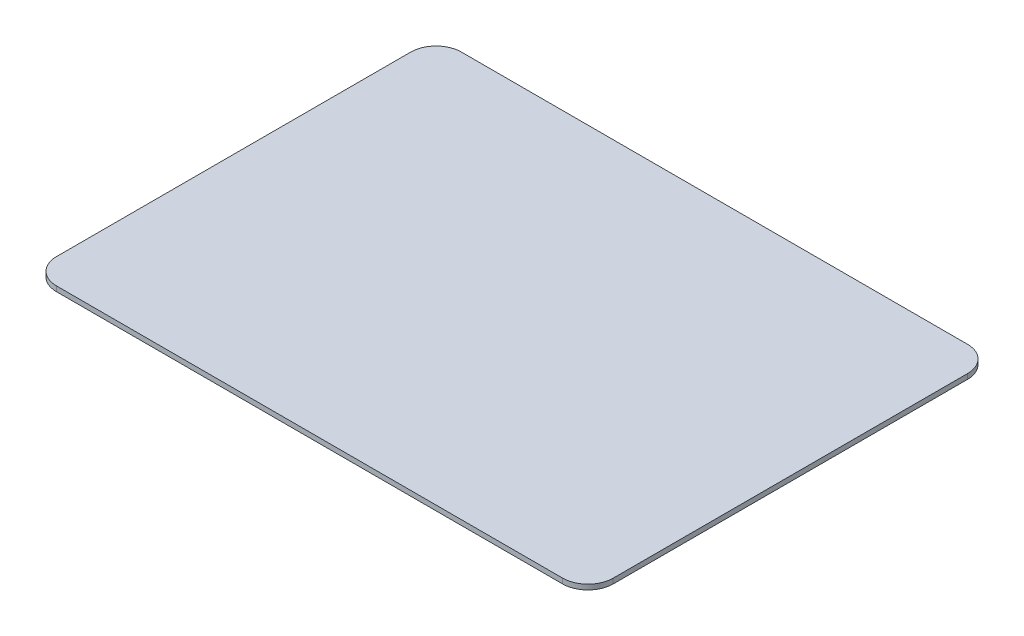
ISO-10303-21;
HEADER;
FILE_DESCRIPTION(('STEP AP214'),'2;1');
FILE_NAME('part.step','',(''),(''),'','','');
FILE_SCHEMA(('AUTOMOTIVE_DESIGN { 1 0 10303 214 1 1 1 1 }'));
ENDSEC;
DATA;
#1=APPLICATION_CONTEXT('core data for automotive mechanical design processes');
#2=APPLICATION_PROTOCOL_DEFINITION('international standard','automotive_design',2000,#1);
#3=PRODUCT_CONTEXT('',#1,'mechanical');
#4=PRODUCT('Part','Part','',(#3));
#5=PRODUCT_RELATED_PRODUCT_CATEGORY('part','',(#4));
#6=PRODUCT_DEFINITION_FORMATION('','',#4);
#7=PRODUCT_DEFINITION_CONTEXT('part definition',#1,'design');
#8=PRODUCT_DEFINITION('design','',#6,#7);
#9=PRODUCT_DEFINITION_SHAPE('','',#8);
#10=(LENGTH_UNIT() NAMED_UNIT(*) SI_UNIT(.MILLI.,.METRE.));
#11=(NAMED_UNIT(*) PLANE_ANGLE_UNIT() SI_UNIT($,.RADIAN.));
#12=(NAMED_UNIT(*) SI_UNIT($,.STERADIAN.) SOLID_ANGLE_UNIT());
#13=UNCERTAINTY_MEASURE_WITH_UNIT(LENGTH_MEASURE(1.E-05),#10,'distance_accuracy_value','');
#14=(GEOMETRIC_REPRESENTATION_CONTEXT(3) GLOBAL_UNCERTAINTY_ASSIGNED_CONTEXT((#13)) GLOBAL_UNIT_ASSIGNED_CONTEXT((#10,
#11,#12)) REPRESENTATION_CONTEXT('',''));
#15=CARTESIAN_POINT('',(0.,0.,0.));
#16=DIRECTION('',(0.,0.,1.));
#17=DIRECTION('',(1.,0.,0.));
#18=AXIS2_PLACEMENT_3D('',#15,#16,#17);
#19=CARTESIAN_POINT('',(127.,2.54,-88.9));
#20=DIRECTION('',(0.,-1.,0.));
#21=DIRECTION('',(0.,0.,-1.));
#22=AXIS2_PLACEMENT_3D('',#19,#20,#21);
#23=CYLINDRICAL_SURFACE('',#22,12.7);
#24=CARTESIAN_POINT('',(127.,0.,-88.9));
#25=DIRECTION('',(0.,1.,0.));
#26=DIRECTION('',(0.,0.,1.));
#27=AXIS2_PLACEMENT_3D('',#24,#25,#26);
#28=CIRCLE('',#27,12.7);
#29=CARTESIAN_POINT('',(139.7,0.,-88.8999999999999));
#30=VERTEX_POINT('',#29);
#31=CARTESIAN_POINT('',(127.,0.,-101.6));
#32=VERTEX_POINT('',#31);
#33=EDGE_CURVE('E137',#30,#32,#28,.T.);
#34=ORIENTED_EDGE('',*,*,#33,.T.);
#35=DIRECTION('',(0.,-1.,0.));
#36=VECTOR('',#35,1.);
#37=CARTESIAN_POINT('',(127.,2.54,-101.6));
#38=LINE('',#37,#36);
#39=CARTESIAN_POINT('',(127.,2.54,-101.6));
#40=VERTEX_POINT('',#39);
#41=EDGE_CURVE('E11',#40,#32,#38,.T.);
#42=ORIENTED_EDGE('',*,*,#41,.F.);
#43=CARTESIAN_POINT('',(127.,2.54,-88.9));
#44=DIRECTION('',(0.,1.,0.));
#45=DIRECTION('',(0.,0.,1.));
#46=AXIS2_PLACEMENT_3D('',#43,#44,#45);
#47=CIRCLE('',#46,12.7);
#48=CARTESIAN_POINT('',(139.7,2.54,-88.8999999999999));
#49=VERTEX_POINT('',#48);
#50=EDGE_CURVE('E151',#49,#40,#47,.T.);
#51=ORIENTED_EDGE('',*,*,#50,.F.);
#52=DIRECTION('',(0.,-1.,0.));
#53=VECTOR('',#52,1.);
#54=CARTESIAN_POINT('',(139.7,2.54,-88.8999999999999));
#55=LINE('',#54,#53);
#56=EDGE_CURVE('E133',#49,#30,#55,.T.);
#57=ORIENTED_EDGE('',*,*,#56,.T.);
#58=EDGE_LOOP('',(#34,#42,#51,#57));
#59=FACE_BOUND('',#58,.T.);
#60=ADVANCED_FACE('F41',(#59),#23,.T.);
#61=CARTESIAN_POINT('',(-127.,2.54,-101.6));
#62=DIRECTION('',(0.,0.,1.));
#63=DIRECTION('',(1.,0.,0.));
#64=AXIS2_PLACEMENT_3D('',#61,#62,#63);
#65=PLANE('',#64);
#66=DIRECTION('',(-1.,0.,0.));
#67=VECTOR('',#66,1.);
#68=CARTESIAN_POINT('',(-127.,0.,-101.6));
#69=LINE('',#68,#67);
#70=CARTESIAN_POINT('',(-127.,0.,-101.6));
#71=VERTEX_POINT('',#70);
#72=EDGE_CURVE('E140',#32,#71,#69,.T.);
#73=ORIENTED_EDGE('',*,*,#72,.T.);
#74=DIRECTION('',(0.,-1.,0.));
#75=VECTOR('',#74,1.);
#76=CARTESIAN_POINT('',(-127.,2.54,-101.6));
#77=LINE('',#76,#75);
#78=CARTESIAN_POINT('',(-127.,2.54,-101.6));
#79=VERTEX_POINT('',#78);
#80=EDGE_CURVE('E49',#79,#71,#77,.T.);
#81=ORIENTED_EDGE('',*,*,#80,.F.);
#82=DIRECTION('',(-1.,0.,0.));
#83=VECTOR('',#82,1.);
#84=CARTESIAN_POINT('',(-127.,2.54,-101.6));
#85=LINE('',#84,#83);
#86=EDGE_CURVE('E100',#40,#79,#85,.T.);
#87=ORIENTED_EDGE('',*,*,#86,.F.);
#88=ORIENTED_EDGE('',*,*,#41,.T.);
#89=EDGE_LOOP('',(#73,#81,#87,#88));
#90=FACE_BOUND('',#89,.T.);
#91=ADVANCED_FACE('F186',(#90),#65,.F.);
#92=CARTESIAN_POINT('',(-127.,2.54,-88.9));
#93=DIRECTION('',(0.,-1.,0.));
#94=DIRECTION('',(0.,0.,-1.));
#95=AXIS2_PLACEMENT_3D('',#92,#93,#94);
#96=CYLINDRICAL_SURFACE('',#95,12.7);
#97=CARTESIAN_POINT('',(-127.,0.,-88.9));
#98=DIRECTION('',(0.,1.,0.));
#99=DIRECTION('',(0.,0.,-1.));
#100=AXIS2_PLACEMENT_3D('',#97,#98,#99);
#101=CIRCLE('',#100,12.7);
#102=CARTESIAN_POINT('',(-139.7,0.,-88.8999999999999));
#103=VERTEX_POINT('',#102);
#104=EDGE_CURVE('E142',#71,#103,#101,.T.);
#105=ORIENTED_EDGE('',*,*,#104,.T.);
#106=DIRECTION('',(0.,-1.,0.));
#107=VECTOR('',#106,1.);
#108=CARTESIAN_POINT('',(-139.7,2.54,-88.8999999999999));
#109=LINE('',#108,#107);
#110=CARTESIAN_POINT('',(-139.7,2.54,-88.8999999999999));
#111=VERTEX_POINT('',#110);
#112=EDGE_CURVE('E158',#111,#103,#109,.T.);
#113=ORIENTED_EDGE('',*,*,#112,.F.);
#114=CARTESIAN_POINT('',(-127.,2.54,-88.9));
#115=DIRECTION('',(0.,1.,0.));
#116=DIRECTION('',(0.,0.,-1.));
#117=AXIS2_PLACEMENT_3D('',#114,#115,#116);
#118=CIRCLE('',#117,12.7);
#119=EDGE_CURVE('E166',#79,#111,#118,.T.);
#120=ORIENTED_EDGE('',*,*,#119,.F.);
#121=ORIENTED_EDGE('',*,*,#80,.T.);
#122=EDGE_LOOP('',(#105,#113,#120,#121));
#123=FACE_BOUND('',#122,.T.);
#124=ADVANCED_FACE('F164',(#123),#96,.T.);
#125=CARTESIAN_POINT('',(-139.7,2.54,88.8999999999999));
#126=DIRECTION('',(1.,0.,0.));
#127=DIRECTION('',(0.,0.,-1.));
#128=AXIS2_PLACEMENT_3D('',#125,#126,#127);
#129=PLANE('',#128);
#130=DIRECTION('',(0.,0.,1.));
#131=VECTOR('',#130,1.);
#132=CARTESIAN_POINT('',(-139.7,0.,88.8999999999999));
#133=LINE('',#132,#131);
#134=CARTESIAN_POINT('',(-139.7,0.,88.8999999999999));
#135=VERTEX_POINT('',#134);
#136=EDGE_CURVE('E144',#103,#135,#133,.T.);
#137=ORIENTED_EDGE('',*,*,#136,.T.);
#138=DIRECTION('',(0.,-1.,0.));
#139=VECTOR('',#138,1.);
#140=CARTESIAN_POINT('',(-139.7,2.54,88.8999999999999));
#141=LINE('',#140,#139);
#142=CARTESIAN_POINT('',(-139.7,2.54,88.8999999999999));
#143=VERTEX_POINT('',#142);
#144=EDGE_CURVE('E155',#143,#135,#141,.T.);
#145=ORIENTED_EDGE('',*,*,#144,.F.);
#146=DIRECTION('',(0.,0.,1.));
#147=VECTOR('',#146,1.);
#148=CARTESIAN_POINT('',(-139.7,2.54,88.8999999999999));
#149=LINE('',#148,#147);
#150=EDGE_CURVE('E178',#111,#143,#149,.T.);
#151=ORIENTED_EDGE('',*,*,#150,.F.);
#152=ORIENTED_EDGE('',*,*,#112,.T.);
#153=EDGE_LOOP('',(#137,#145,#151,#152));
#154=FACE_BOUND('',#153,.T.);
#155=ADVANCED_FACE('F174',(#154),#129,.F.);
#156=CARTESIAN_POINT('',(-127.,2.54,88.9));
#157=DIRECTION('',(0.,-1.,0.));
#158=DIRECTION('',(0.,0.,-1.));
#159=AXIS2_PLACEMENT_3D('',#156,#157,#158);
#160=CYLINDRICAL_SURFACE('',#159,12.7);
#161=CARTESIAN_POINT('',(-127.,0.,88.9));
#162=DIRECTION('',(0.,1.,0.));
#163=DIRECTION('',(0.,0.,1.));
#164=AXIS2_PLACEMENT_3D('',#161,#162,#163);
#165=CIRCLE('',#164,12.7);
#166=CARTESIAN_POINT('',(-127.,0.,101.6));
#167=VERTEX_POINT('',#166);
#168=EDGE_CURVE('E146',#135,#167,#165,.T.);
#169=ORIENTED_EDGE('',*,*,#168,.T.);
#170=DIRECTION('',(0.,-1.,0.));
#171=VECTOR('',#170,1.);
#172=CARTESIAN_POINT('',(-127.,2.54,101.6));
#173=LINE('',#172,#171);
#174=CARTESIAN_POINT('',(-127.,2.54,101.6));
#175=VERTEX_POINT('',#174);
#176=EDGE_CURVE('E128',#175,#167,#173,.T.);
#177=ORIENTED_EDGE('',*,*,#176,.F.);
#178=CARTESIAN_POINT('',(-127.,2.54,88.9));
#179=DIRECTION('',(0.,1.,0.));
#180=DIRECTION('',(0.,0.,1.));
#181=AXIS2_PLACEMENT_3D('',#178,#179,#180);
#182=CIRCLE('',#181,12.7);
#183=EDGE_CURVE('E119',#143,#175,#182,.T.);
#184=ORIENTED_EDGE('',*,*,#183,.F.);
#185=ORIENTED_EDGE('',*,*,#144,.T.);
#186=EDGE_LOOP('',(#169,#177,#184,#185));
#187=FACE_BOUND('',#186,.T.);
#188=ADVANCED_FACE('F177',(#187),#160,.T.);
#189=CARTESIAN_POINT('',(-127.,2.54,101.6));
#190=DIRECTION('',(0.,0.,-1.));
#191=DIRECTION('',(-1.,0.,0.));
#192=AXIS2_PLACEMENT_3D('',#189,#190,#191);
#193=PLANE('',#192);
#194=DIRECTION('',(1.,0.,0.));
#195=VECTOR('',#194,1.);
#196=CARTESIAN_POINT('',(-127.,0.,101.6));
#197=LINE('',#196,#195);
#198=CARTESIAN_POINT('',(127.,0.,101.6));
#199=VERTEX_POINT('',#198);
#200=EDGE_CURVE('E127',#167,#199,#197,.T.);
#201=ORIENTED_EDGE('',*,*,#200,.T.);
#202=DIRECTION('',(0.,-1.,0.));
#203=VECTOR('',#202,1.);
#204=CARTESIAN_POINT('',(127.,2.54,101.6));
#205=LINE('',#204,#203);
#206=CARTESIAN_POINT('',(127.,2.54,101.6));
#207=VERTEX_POINT('',#206);
#208=EDGE_CURVE('E124',#207,#199,#205,.T.);
#209=ORIENTED_EDGE('',*,*,#208,.F.);
#210=DIRECTION('',(1.,0.,0.));
#211=VECTOR('',#210,1.);
#212=CARTESIAN_POINT('',(-127.,2.54,101.6));
#213=LINE('',#212,#211);
#214=EDGE_CURVE('E113',#175,#207,#213,.T.);
#215=ORIENTED_EDGE('',*,*,#214,.F.);
#216=ORIENTED_EDGE('',*,*,#176,.T.);
#217=EDGE_LOOP('',(#201,#209,#215,#216));
#218=FACE_BOUND('',#217,.T.);
#219=ADVANCED_FACE('F125',(#218),#193,.F.);
#220=CARTESIAN_POINT('',(127.,2.54,88.9));
#221=DIRECTION('',(0.,-1.,0.));
#222=DIRECTION('',(0.,0.,-1.));
#223=AXIS2_PLACEMENT_3D('',#220,#221,#222);
#224=CYLINDRICAL_SURFACE('',#223,12.7);
#225=CARTESIAN_POINT('',(127.,0.,88.9));
#226=DIRECTION('',(0.,1.,0.));
#227=DIRECTION('',(0.,0.,1.));
#228=AXIS2_PLACEMENT_3D('',#225,#226,#227);
#229=CIRCLE('',#228,12.7);
#230=CARTESIAN_POINT('',(139.7,0.,88.8999999999999));
#231=VERTEX_POINT('',#230);
#232=EDGE_CURVE('E86',#199,#231,#229,.T.);
#233=ORIENTED_EDGE('',*,*,#232,.T.);
#234=DIRECTION('',(0.,-1.,0.));
#235=VECTOR('',#234,1.);
#236=CARTESIAN_POINT('',(139.7,2.54,88.8999999999999));
#237=LINE('',#236,#235);
#238=CARTESIAN_POINT('',(139.7,2.54,88.8999999999999));
#239=VERTEX_POINT('',#238);
#240=EDGE_CURVE('E129',#239,#231,#237,.T.);
#241=ORIENTED_EDGE('',*,*,#240,.F.);
#242=CARTESIAN_POINT('',(127.,2.54,88.9));
#243=DIRECTION('',(0.,1.,0.));
#244=DIRECTION('',(0.,0.,1.));
#245=AXIS2_PLACEMENT_3D('',#242,#243,#244);
#246=CIRCLE('',#245,12.7);
#247=EDGE_CURVE('E117',#207,#239,#246,.T.);
#248=ORIENTED_EDGE('',*,*,#247,.F.);
#249=ORIENTED_EDGE('',*,*,#208,.T.);
#250=EDGE_LOOP('',(#233,#241,#248,#249));
#251=FACE_BOUND('',#250,.T.);
#252=ADVANCED_FACE('F131',(#251),#224,.T.);
#253=CARTESIAN_POINT('',(139.7,2.54,88.8999999999999));
#254=DIRECTION('',(-1.,0.,0.));
#255=DIRECTION('',(0.,0.,1.));
#256=AXIS2_PLACEMENT_3D('',#253,#254,#255);
#257=PLANE('',#256);
#258=DIRECTION('',(0.,0.,-1.));
#259=VECTOR('',#258,1.);
#260=CARTESIAN_POINT('',(139.7,0.,88.8999999999999));
#261=LINE('',#260,#259);
#262=EDGE_CURVE('E92',#231,#30,#261,.T.);
#263=ORIENTED_EDGE('',*,*,#262,.T.);
#264=ORIENTED_EDGE('',*,*,#56,.F.);
#265=DIRECTION('',(0.,0.,-1.));
#266=VECTOR('',#265,1.);
#267=CARTESIAN_POINT('',(139.7,2.54,88.8999999999999));
#268=LINE('',#267,#266);
#269=EDGE_CURVE('E57',#239,#49,#268,.T.);
#270=ORIENTED_EDGE('',*,*,#269,.F.);
#271=ORIENTED_EDGE('',*,*,#240,.T.);
#272=EDGE_LOOP('',(#263,#264,#270,#271));
#273=FACE_BOUND('',#272,.T.);
#274=ADVANCED_FACE('F202',(#273),#257,.F.);
#275=CARTESIAN_POINT('',(127.,2.54,-88.9));
#276=DIRECTION('',(0.,1.,0.));
#277=DIRECTION('',(0.,0.,1.));
#278=AXIS2_PLACEMENT_3D('',#275,#276,#277);
#279=PLANE('',#278);
#280=ORIENTED_EDGE('',*,*,#50,.T.);
#281=ORIENTED_EDGE('',*,*,#86,.T.);
#282=ORIENTED_EDGE('',*,*,#119,.T.);
#283=ORIENTED_EDGE('',*,*,#150,.T.);
#284=ORIENTED_EDGE('',*,*,#183,.T.);
#285=ORIENTED_EDGE('',*,*,#214,.T.);
#286=ORIENTED_EDGE('',*,*,#247,.T.);
#287=ORIENTED_EDGE('',*,*,#269,.T.);
#288=EDGE_LOOP('',(#280,#281,#282,#283,#284,#285,#286,#287));
#289=FACE_BOUND('',#288,.T.);
#290=ADVANCED_FACE('F115',(#289),#279,.T.);
#291=CARTESIAN_POINT('',(127.,0.,-88.9));
#292=DIRECTION('',(0.,1.,0.));
#293=DIRECTION('',(0.,0.,1.));
#294=AXIS2_PLACEMENT_3D('',#291,#292,#293);
#295=PLANE('',#294);
#296=ORIENTED_EDGE('',*,*,#33,.F.);
#297=ORIENTED_EDGE('',*,*,#262,.F.);
#298=ORIENTED_EDGE('',*,*,#232,.F.);
#299=ORIENTED_EDGE('',*,*,#200,.F.);
#300=ORIENTED_EDGE('',*,*,#168,.F.);
#301=ORIENTED_EDGE('',*,*,#136,.F.);
#302=ORIENTED_EDGE('',*,*,#104,.F.);
#303=ORIENTED_EDGE('',*,*,#72,.F.);
#304=EDGE_LOOP('',(#296,#297,#298,#299,#300,#301,#302,#303));
#305=FACE_BOUND('',#304,.T.);
#306=ADVANCED_FACE('F170',(#305),#295,.F.);
#307=CLOSED_SHELL('',(#60,#91,#124,#155,#188,#219,#252,#274,#290,#306));
#308=MANIFOLD_SOLID_BREP('B2',#307);
#309=ADVANCED_BREP_SHAPE_REPRESENTATION('',(#18,#308),#14);
#310=SHAPE_DEFINITION_REPRESENTATION(#9,#309);
ENDSEC;
END-ISO-10303-21;
